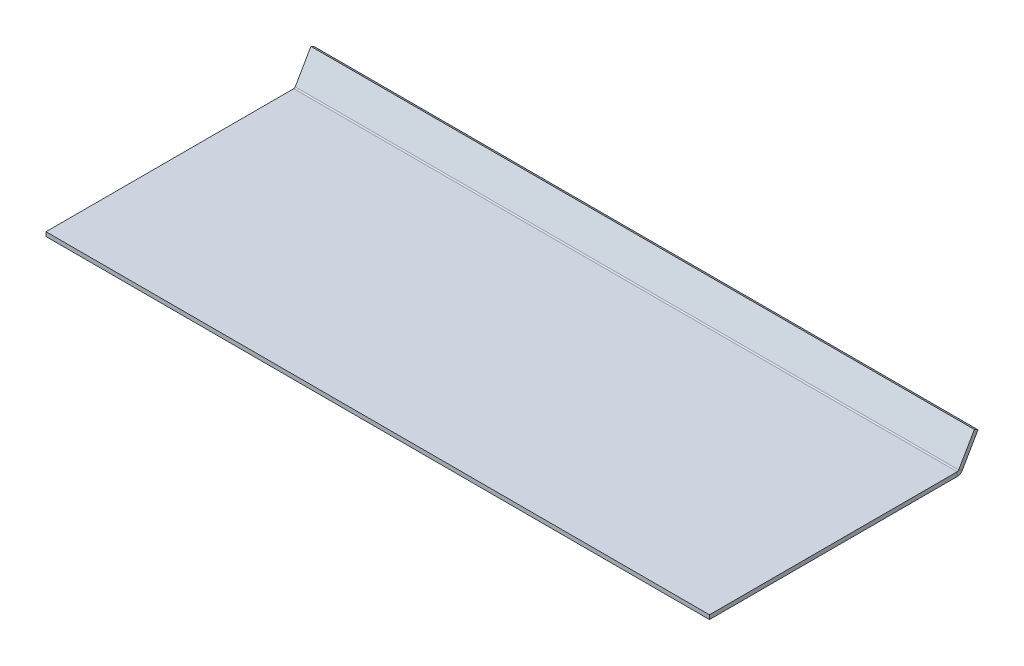
ISO-10303-21;
HEADER;
FILE_DESCRIPTION(('STEP AP214'),'2;1');
FILE_NAME('part.step','',(''),(''),'','','');
FILE_SCHEMA(('AUTOMOTIVE_DESIGN { 1 0 10303 214 1 1 1 1 }'));
ENDSEC;
DATA;
#1=APPLICATION_CONTEXT('core data for automotive mechanical design processes');
#2=APPLICATION_PROTOCOL_DEFINITION('international standard','automotive_design',2000,#1);
#3=PRODUCT_CONTEXT('',#1,'mechanical');
#4=PRODUCT('Part','Part','',(#3));
#5=PRODUCT_RELATED_PRODUCT_CATEGORY('part','',(#4));
#6=PRODUCT_DEFINITION_FORMATION('','',#4);
#7=PRODUCT_DEFINITION_CONTEXT('part definition',#1,'design');
#8=PRODUCT_DEFINITION('design','',#6,#7);
#9=PRODUCT_DEFINITION_SHAPE('','',#8);
#10=(LENGTH_UNIT() NAMED_UNIT(*) SI_UNIT(.MILLI.,.METRE.));
#11=(NAMED_UNIT(*) PLANE_ANGLE_UNIT() SI_UNIT($,.RADIAN.));
#12=(NAMED_UNIT(*) SI_UNIT($,.STERADIAN.) SOLID_ANGLE_UNIT());
#13=UNCERTAINTY_MEASURE_WITH_UNIT(LENGTH_MEASURE(1.E-05),#10,'distance_accuracy_value','');
#14=(GEOMETRIC_REPRESENTATION_CONTEXT(3) GLOBAL_UNCERTAINTY_ASSIGNED_CONTEXT((#13)) GLOBAL_UNIT_ASSIGNED_CONTEXT((#10,
#11,#12)) REPRESENTATION_CONTEXT('',''));
#15=CARTESIAN_POINT('',(0.,0.,0.));
#16=DIRECTION('',(0.,0.,1.));
#17=DIRECTION('',(1.,0.,0.));
#18=AXIS2_PLACEMENT_3D('',#15,#16,#17);
#19=CARTESIAN_POINT('',(0.,-153.856428912338,-88.5494836543993));
#20=DIRECTION('',(0.,-0.499999999999998,-0.86602540378444));
#21=DIRECTION('',(0.,0.86602540378444,-0.499999999999998));
#22=AXIS2_PLACEMENT_3D('',#19,#20,#21);
#23=PLANE('',#22);
#24=DIRECTION('',(0.,-0.86602540378444,0.499999999999998));
#25=VECTOR('',#24,1.);
#26=CARTESIAN_POINT('',(0.,-153.856428912338,-88.5494836543993));
#27=LINE('',#26,#25);
#28=CARTESIAN_POINT('',(0.,22.1199331366604,-190.149483654399));
#29=VERTEX_POINT('',#28);
#30=CARTESIAN_POINT('',(0.,2.635,-178.899852262806));
#31=VERTEX_POINT('',#30);
#32=EDGE_CURVE('E51',#29,#31,#27,.T.);
#33=ORIENTED_EDGE('',*,*,#32,.T.);
#34=DIRECTION('',(1.,0.,0.));
#35=VECTOR('',#34,1.);
#36=CARTESIAN_POINT('',(0.,2.635,-178.899852262806));
#37=LINE('',#36,#35);
#38=CARTESIAN_POINT('',(476.25,2.635,-178.899852262806));
#39=VERTEX_POINT('',#38);
#40=EDGE_CURVE('E172',#31,#39,#37,.T.);
#41=ORIENTED_EDGE('',*,*,#40,.T.);
#42=DIRECTION('',(0.,0.86602540378444,-0.499999999999998));
#43=VECTOR('',#42,1.);
#44=CARTESIAN_POINT('',(476.25,-153.856428912338,-88.5494836543993));
#45=LINE('',#44,#43);
#46=CARTESIAN_POINT('',(476.25,22.1199331366604,-190.149483654399));
#47=VERTEX_POINT('',#46);
#48=EDGE_CURVE('E157',#39,#47,#45,.T.);
#49=ORIENTED_EDGE('',*,*,#48,.T.);
#50=DIRECTION('',(-1.,0.,0.));
#51=VECTOR('',#50,1.);
#52=CARTESIAN_POINT('',(0.,22.1199331366604,-190.149483654399));
#53=LINE('',#52,#51);
#54=EDGE_CURVE('E162',#47,#29,#53,.T.);
#55=ORIENTED_EDGE('',*,*,#54,.T.);
#56=EDGE_LOOP('',(#33,#41,#49,#55));
#57=FACE_BOUND('',#56,.T.);
#58=ADVANCED_FACE('F47',(#57),#23,.F.);
#59=CARTESIAN_POINT('',(476.25,-153.856428912338,-88.5494836543993));
#60=DIRECTION('',(-1.,0.,0.));
#61=DIRECTION('',(0.,0.86602540378444,-0.499999999999998));
#62=AXIS2_PLACEMENT_3D('',#59,#60,#61);
#63=PLANE('',#62);
#64=DIRECTION('',(0.,0.499999999999998,0.86602540378444));
#65=VECTOR('',#64,1.);
#66=CARTESIAN_POINT('',(476.25,2.635,-178.899852262806));
#67=LINE('',#66,#65);
#68=CARTESIAN_POINT('',(476.25,1.13499999999999,-181.49792847416));
#69=VERTEX_POINT('',#68);
#70=EDGE_CURVE('E12',#69,#39,#67,.T.);
#71=ORIENTED_EDGE('',*,*,#70,.F.);
#72=DIRECTION('',(0.,0.86602540378444,-0.499999999999998));
#73=VECTOR('',#72,1.);
#74=CARTESIAN_POINT('',(476.25,-155.356428912338,-91.1475598657526));
#75=LINE('',#74,#73);
#76=CARTESIAN_POINT('',(476.25,20.6199331366604,-192.747559865752));
#77=VERTEX_POINT('',#76);
#78=EDGE_CURVE('E87',#69,#77,#75,.T.);
#79=ORIENTED_EDGE('',*,*,#78,.T.);
#80=DIRECTION('',(0.,0.499999999999998,0.86602540378444));
#81=VECTOR('',#80,1.);
#82=CARTESIAN_POINT('',(476.25,22.1199331366604,-190.149483654399));
#83=LINE('',#82,#81);
#84=EDGE_CURVE('E158',#77,#47,#83,.T.);
#85=ORIENTED_EDGE('',*,*,#84,.T.);
#86=ORIENTED_EDGE('',*,*,#48,.F.);
#87=EDGE_LOOP('',(#71,#79,#85,#86));
#88=FACE_BOUND('',#87,.T.);
#89=ADVANCED_FACE('F49',(#88),#63,.F.);
#90=CARTESIAN_POINT('',(0.,22.1199331366604,-190.149483654399));
#91=DIRECTION('',(0.,-0.86602540378444,0.499999999999998));
#92=DIRECTION('',(-1.,0.,0.));
#93=AXIS2_PLACEMENT_3D('',#90,#91,#92);
#94=PLANE('',#93);
#95=ORIENTED_EDGE('',*,*,#84,.F.);
#96=DIRECTION('',(1.,0.,0.));
#97=VECTOR('',#96,1.);
#98=CARTESIAN_POINT('',(0.,20.6199331366604,-192.747559865752));
#99=LINE('',#98,#97);
#100=CARTESIAN_POINT('',(0.,20.6199331366604,-192.747559865752));
#101=VERTEX_POINT('',#100);
#102=EDGE_CURVE('E152',#77,#101,#99,.F.);
#103=ORIENTED_EDGE('',*,*,#102,.T.);
#104=DIRECTION('',(0.,0.499999999999998,0.86602540378444));
#105=VECTOR('',#104,1.);
#106=CARTESIAN_POINT('',(0.,22.1199331366604,-190.149483654399));
#107=LINE('',#106,#105);
#108=EDGE_CURVE('E73',#101,#29,#107,.T.);
#109=ORIENTED_EDGE('',*,*,#108,.T.);
#110=ORIENTED_EDGE('',*,*,#54,.F.);
#111=EDGE_LOOP('',(#95,#103,#109,#110));
#112=FACE_BOUND('',#111,.T.);
#113=ADVANCED_FACE('F255',(#112),#94,.F.);
#114=CARTESIAN_POINT('',(0.,-153.856428912338,-88.5494836543993));
#115=DIRECTION('',(1.,0.,0.));
#116=DIRECTION('',(0.,-0.86602540378444,0.499999999999998));
#117=AXIS2_PLACEMENT_3D('',#114,#115,#116);
#118=PLANE('',#117);
#119=DIRECTION('',(0.,-0.499999999999998,-0.86602540378444));
#120=VECTOR('',#119,1.);
#121=CARTESIAN_POINT('',(0.,2.635,-178.899852262806));
#122=LINE('',#121,#120);
#123=CARTESIAN_POINT('',(0.,1.13499999999999,-181.49792847416));
#124=VERTEX_POINT('',#123);
#125=EDGE_CURVE('E139',#31,#124,#122,.T.);
#126=ORIENTED_EDGE('',*,*,#125,.F.);
#127=ORIENTED_EDGE('',*,*,#32,.F.);
#128=ORIENTED_EDGE('',*,*,#108,.F.);
#129=DIRECTION('',(0.,0.86602540378444,-0.499999999999998));
#130=VECTOR('',#129,1.);
#131=CARTESIAN_POINT('',(0.,-155.356428912338,-91.1475598657526));
#132=LINE('',#131,#130);
#133=EDGE_CURVE('E154',#101,#124,#132,.F.);
#134=ORIENTED_EDGE('',*,*,#133,.T.);
#135=EDGE_LOOP('',(#126,#127,#128,#134));
#136=FACE_BOUND('',#135,.T.);
#137=ADVANCED_FACE('F258',(#136),#118,.F.);
#138=CARTESIAN_POINT('',(0.,-155.356428912338,-91.1475598657526));
#139=DIRECTION('',(0.,-0.499999999999998,-0.86602540378444));
#140=DIRECTION('',(0.,0.86602540378444,-0.499999999999998));
#141=AXIS2_PLACEMENT_3D('',#138,#139,#140);
#142=PLANE('',#141);
#143=DIRECTION('',(1.,0.,0.));
#144=VECTOR('',#143,1.);
#145=CARTESIAN_POINT('',(0.,1.135,-181.49792847416));
#146=LINE('',#145,#144);
#147=EDGE_CURVE('E57',#124,#69,#146,.T.);
#148=ORIENTED_EDGE('',*,*,#147,.F.);
#149=ORIENTED_EDGE('',*,*,#133,.F.);
#150=ORIENTED_EDGE('',*,*,#102,.F.);
#151=ORIENTED_EDGE('',*,*,#78,.F.);
#152=EDGE_LOOP('',(#148,#149,#150,#151));
#153=FACE_BOUND('',#152,.T.);
#154=ADVANCED_FACE('F151',(#153),#142,.T.);
#155=CARTESIAN_POINT('',(0.,2.,0.));
#156=DIRECTION('',(0.,0.,-1.));
#157=DIRECTION('',(1.,0.,0.));
#158=AXIS2_PLACEMENT_3D('',#155,#156,#157);
#159=PLANE('',#158);
#160=DIRECTION('',(1.,0.,0.));
#161=VECTOR('',#160,1.);
#162=CARTESIAN_POINT('',(0.,-1.,0.));
#163=LINE('',#162,#161);
#164=CARTESIAN_POINT('',(0.,-1.,0.));
#165=VERTEX_POINT('',#164);
#166=CARTESIAN_POINT('',(476.25,-1.,0.));
#167=VERTEX_POINT('',#166);
#168=EDGE_CURVE('E183',#165,#167,#163,.T.);
#169=ORIENTED_EDGE('',*,*,#168,.T.);
#170=DIRECTION('',(0.,1.,0.));
#171=VECTOR('',#170,1.);
#172=CARTESIAN_POINT('',(476.25,2.,0.));
#173=LINE('',#172,#171);
#174=CARTESIAN_POINT('',(476.25,2.,0.));
#175=VERTEX_POINT('',#174);
#176=EDGE_CURVE('E96',#167,#175,#173,.T.);
#177=ORIENTED_EDGE('',*,*,#176,.T.);
#178=DIRECTION('',(1.,0.,0.));
#179=VECTOR('',#178,1.);
#180=CARTESIAN_POINT('',(0.,2.,0.));
#181=LINE('',#180,#179);
#182=CARTESIAN_POINT('',(0.,2.,0.));
#183=VERTEX_POINT('',#182);
#184=EDGE_CURVE('E192',#183,#175,#181,.T.);
#185=ORIENTED_EDGE('',*,*,#184,.F.);
#186=DIRECTION('',(0.,1.,0.));
#187=VECTOR('',#186,1.);
#188=CARTESIAN_POINT('',(0.,2.,0.));
#189=LINE('',#188,#187);
#190=EDGE_CURVE('E207',#165,#183,#189,.T.);
#191=ORIENTED_EDGE('',*,*,#190,.F.);
#192=EDGE_LOOP('',(#169,#177,#185,#191));
#193=FACE_BOUND('',#192,.T.);
#194=ADVANCED_FACE('F237',(#193),#159,.F.);
#195=CARTESIAN_POINT('',(0.,2.,0.));
#196=DIRECTION('',(0.,-1.,0.));
#197=DIRECTION('',(0.,0.,-1.));
#198=AXIS2_PLACEMENT_3D('',#195,#196,#197);
#199=PLANE('',#198);
#200=DIRECTION('',(1.,0.,0.));
#201=VECTOR('',#200,1.);
#202=CARTESIAN_POINT('',(0.,2.,-177.8));
#203=LINE('',#202,#201);
#204=CARTESIAN_POINT('',(0.,2.,-177.8));
#205=VERTEX_POINT('',#204);
#206=CARTESIAN_POINT('',(476.25,2.,-177.8));
#207=VERTEX_POINT('',#206);
#208=EDGE_CURVE('E121',#205,#207,#203,.T.);
#209=ORIENTED_EDGE('',*,*,#208,.F.);
#210=DIRECTION('',(0.,0.,1.));
#211=VECTOR('',#210,1.);
#212=CARTESIAN_POINT('',(0.,2.,0.));
#213=LINE('',#212,#211);
#214=EDGE_CURVE('E189',#205,#183,#213,.T.);
#215=ORIENTED_EDGE('',*,*,#214,.T.);
#216=ORIENTED_EDGE('',*,*,#184,.T.);
#217=DIRECTION('',(0.,0.,-1.));
#218=VECTOR('',#217,1.);
#219=CARTESIAN_POINT('',(476.25,2.,0.));
#220=LINE('',#219,#218);
#221=EDGE_CURVE('E196',#175,#207,#220,.T.);
#222=ORIENTED_EDGE('',*,*,#221,.T.);
#223=EDGE_LOOP('',(#209,#215,#216,#222));
#224=FACE_BOUND('',#223,.T.);
#225=ADVANCED_FACE('F229',(#224),#199,.F.);
#226=CARTESIAN_POINT('',(0.,2.,0.));
#227=DIRECTION('',(1.,0.,0.));
#228=DIRECTION('',(0.,0.,1.));
#229=AXIS2_PLACEMENT_3D('',#226,#227,#228);
#230=PLANE('',#229);
#231=ORIENTED_EDGE('',*,*,#214,.F.);
#232=DIRECTION('',(0.,-1.,0.));
#233=VECTOR('',#232,1.);
#234=CARTESIAN_POINT('',(0.,1.99999999999999,-177.8));
#235=LINE('',#234,#233);
#236=CARTESIAN_POINT('',(0.,-1.,-177.8));
#237=VERTEX_POINT('',#236);
#238=EDGE_CURVE('E200',#205,#237,#235,.T.);
#239=ORIENTED_EDGE('',*,*,#238,.T.);
#240=DIRECTION('',(0.,0.,-1.));
#241=VECTOR('',#240,1.);
#242=CARTESIAN_POINT('',(0.,-1.,0.));
#243=LINE('',#242,#241);
#244=EDGE_CURVE('E204',#237,#165,#243,.F.);
#245=ORIENTED_EDGE('',*,*,#244,.T.);
#246=ORIENTED_EDGE('',*,*,#190,.T.);
#247=EDGE_LOOP('',(#231,#239,#245,#246));
#248=FACE_BOUND('',#247,.T.);
#249=ADVANCED_FACE('F231',(#248),#230,.F.);
#250=CARTESIAN_POINT('',(0.,-1.,0.));
#251=DIRECTION('',(0.,-1.,0.));
#252=DIRECTION('',(0.,0.,-1.));
#253=AXIS2_PLACEMENT_3D('',#250,#251,#252);
#254=PLANE('',#253);
#255=ORIENTED_EDGE('',*,*,#244,.F.);
#256=DIRECTION('',(1.,0.,0.));
#257=VECTOR('',#256,1.);
#258=CARTESIAN_POINT('',(0.,-1.,-177.8));
#259=LINE('',#258,#257);
#260=CARTESIAN_POINT('',(476.25,-1.,-177.8));
#261=VERTEX_POINT('',#260);
#262=EDGE_CURVE('E211',#237,#261,#259,.T.);
#263=ORIENTED_EDGE('',*,*,#262,.T.);
#264=DIRECTION('',(0.,0.,-1.));
#265=VECTOR('',#264,1.);
#266=CARTESIAN_POINT('',(476.25,-1.,0.));
#267=LINE('',#266,#265);
#268=EDGE_CURVE('E215',#167,#261,#267,.T.);
#269=ORIENTED_EDGE('',*,*,#268,.F.);
#270=ORIENTED_EDGE('',*,*,#168,.F.);
#271=EDGE_LOOP('',(#255,#263,#269,#270));
#272=FACE_BOUND('',#271,.T.);
#273=ADVANCED_FACE('F240',(#272),#254,.T.);
#274=CARTESIAN_POINT('',(476.25,2.,0.));
#275=DIRECTION('',(-1.,0.,0.));
#276=DIRECTION('',(0.,0.,-1.));
#277=AXIS2_PLACEMENT_3D('',#274,#275,#276);
#278=PLANE('',#277);
#279=ORIENTED_EDGE('',*,*,#268,.T.);
#280=DIRECTION('',(0.,1.,0.));
#281=VECTOR('',#280,1.);
#282=CARTESIAN_POINT('',(476.25,1.99999999999999,-177.8));
#283=LINE('',#282,#281);
#284=EDGE_CURVE('E146',#261,#207,#283,.T.);
#285=ORIENTED_EDGE('',*,*,#284,.T.);
#286=ORIENTED_EDGE('',*,*,#221,.F.);
#287=ORIENTED_EDGE('',*,*,#176,.F.);
#288=EDGE_LOOP('',(#279,#285,#286,#287));
#289=FACE_BOUND('',#288,.T.);
#290=ADVANCED_FACE('F238',(#289),#278,.F.);
#291=CARTESIAN_POINT('',(0.,3.27,-177.8));
#292=DIRECTION('',(1.,0.,0.));
#293=DIRECTION('',(0.,0.,-1.));
#294=AXIS2_PLACEMENT_3D('',#291,#292,#293);
#295=PLANE('',#294);
#296=ORIENTED_EDGE('',*,*,#125,.T.);
#297=CARTESIAN_POINT('',(0.,3.27,-177.8));
#298=DIRECTION('',(-1.,0.,0.));
#299=DIRECTION('',(0.,0.,1.));
#300=AXIS2_PLACEMENT_3D('',#297,#298,#299);
#301=CIRCLE('',#300,4.27);
#302=EDGE_CURVE('E115',#124,#237,#301,.T.);
#303=ORIENTED_EDGE('',*,*,#302,.T.);
#304=ORIENTED_EDGE('',*,*,#238,.F.);
#305=CARTESIAN_POINT('',(0.,3.27,-177.8));
#306=DIRECTION('',(-1.,0.,0.));
#307=DIRECTION('',(0.,0.,1.));
#308=AXIS2_PLACEMENT_3D('',#305,#306,#307);
#309=CIRCLE('',#308,1.27);
#310=EDGE_CURVE('E148',#31,#205,#309,.T.);
#311=ORIENTED_EDGE('',*,*,#310,.F.);
#312=EDGE_LOOP('',(#296,#303,#304,#311));
#313=FACE_BOUND('',#312,.T.);
#314=ADVANCED_FACE('F247',(#313),#295,.F.);
#315=CARTESIAN_POINT('',(476.25,3.27,-177.8));
#316=DIRECTION('',(-1.,0.,0.));
#317=DIRECTION('',(0.,0.,1.));
#318=AXIS2_PLACEMENT_3D('',#315,#316,#317);
#319=PLANE('',#318);
#320=CARTESIAN_POINT('',(476.25,3.27,-177.8));
#321=DIRECTION('',(-1.,0.,0.));
#322=DIRECTION('',(0.,0.,1.));
#323=AXIS2_PLACEMENT_3D('',#320,#321,#322);
#324=CIRCLE('',#323,4.27);
#325=EDGE_CURVE('E134',#261,#69,#324,.F.);
#326=ORIENTED_EDGE('',*,*,#325,.T.);
#327=ORIENTED_EDGE('',*,*,#70,.T.);
#328=CARTESIAN_POINT('',(476.25,3.27,-177.8));
#329=DIRECTION('',(1.,0.,0.));
#330=DIRECTION('',(0.,0.,-1.));
#331=AXIS2_PLACEMENT_3D('',#328,#329,#330);
#332=CIRCLE('',#331,1.27);
#333=EDGE_CURVE('E65',#207,#39,#332,.T.);
#334=ORIENTED_EDGE('',*,*,#333,.F.);
#335=ORIENTED_EDGE('',*,*,#284,.F.);
#336=EDGE_LOOP('',(#326,#327,#334,#335));
#337=FACE_BOUND('',#336,.T.);
#338=ADVANCED_FACE('F143',(#337),#319,.F.);
#339=CARTESIAN_POINT('',(714.39328235397,3.27,-177.8));
#340=DIRECTION('',(-1.,0.,0.));
#341=DIRECTION('',(0.,0.,1.));
#342=AXIS2_PLACEMENT_3D('',#339,#340,#341);
#343=CYLINDRICAL_SURFACE('',#342,1.27);
#344=ORIENTED_EDGE('',*,*,#208,.T.);
#345=ORIENTED_EDGE('',*,*,#333,.T.);
#346=ORIENTED_EDGE('',*,*,#40,.F.);
#347=ORIENTED_EDGE('',*,*,#310,.T.);
#348=EDGE_LOOP('',(#344,#345,#346,#347));
#349=FACE_BOUND('',#348,.T.);
#350=ADVANCED_FACE('F226',(#349),#343,.F.);
#351=CARTESIAN_POINT('',(714.39328235397,3.27,-177.8));
#352=DIRECTION('',(-1.,0.,0.));
#353=DIRECTION('',(0.,0.,1.));
#354=AXIS2_PLACEMENT_3D('',#351,#352,#353);
#355=CYLINDRICAL_SURFACE('',#354,4.27);
#356=ORIENTED_EDGE('',*,*,#262,.F.);
#357=ORIENTED_EDGE('',*,*,#302,.F.);
#358=ORIENTED_EDGE('',*,*,#147,.T.);
#359=ORIENTED_EDGE('',*,*,#325,.F.);
#360=EDGE_LOOP('',(#356,#357,#358,#359));
#361=FACE_BOUND('',#360,.T.);
#362=ADVANCED_FACE('F133',(#361),#355,.T.);
#363=CLOSED_SHELL('',(#58,#89,#113,#137,#154,#194,#225,#249,#273,#290,#314,#338,#350,#362));
#364=MANIFOLD_SOLID_BREP('B2',#363);
#365=ADVANCED_BREP_SHAPE_REPRESENTATION('',(#18,#364),#14);
#366=SHAPE_DEFINITION_REPRESENTATION(#9,#365);
ENDSEC;
END-ISO-10303-21;
